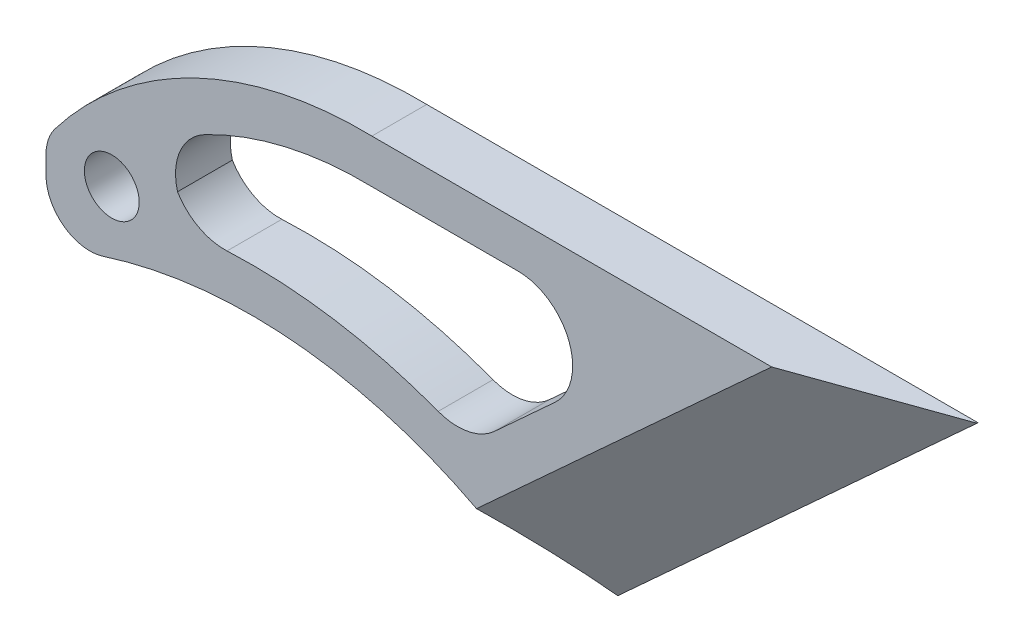
ISO-10303-21;
HEADER;
FILE_DESCRIPTION(('STEP AP214'),'2;1');
FILE_NAME('part.step','',(''),(''),'','','');
FILE_SCHEMA(('AUTOMOTIVE_DESIGN { 1 0 10303 214 1 1 1 1 }'));
ENDSEC;
DATA;
#1=APPLICATION_CONTEXT('core data for automotive mechanical design processes');
#2=APPLICATION_PROTOCOL_DEFINITION('international standard','automotive_design',2000,#1);
#3=PRODUCT_CONTEXT('',#1,'mechanical');
#4=PRODUCT('Part','Part','',(#3));
#5=PRODUCT_RELATED_PRODUCT_CATEGORY('part','',(#4));
#6=PRODUCT_DEFINITION_FORMATION('','',#4);
#7=PRODUCT_DEFINITION_CONTEXT('part definition',#1,'design');
#8=PRODUCT_DEFINITION('design','',#6,#7);
#9=PRODUCT_DEFINITION_SHAPE('','',#8);
#10=(LENGTH_UNIT() NAMED_UNIT(*) SI_UNIT(.MILLI.,.METRE.));
#11=(NAMED_UNIT(*) PLANE_ANGLE_UNIT() SI_UNIT($,.RADIAN.));
#12=(NAMED_UNIT(*) SI_UNIT($,.STERADIAN.) SOLID_ANGLE_UNIT());
#13=UNCERTAINTY_MEASURE_WITH_UNIT(LENGTH_MEASURE(1.E-05),#10,'distance_accuracy_value','');
#14=(GEOMETRIC_REPRESENTATION_CONTEXT(3) GLOBAL_UNCERTAINTY_ASSIGNED_CONTEXT((#13)) GLOBAL_UNIT_ASSIGNED_CONTEXT((#10,
#11,#12)) REPRESENTATION_CONTEXT('',''));
#15=CARTESIAN_POINT('',(0.,0.,0.));
#16=DIRECTION('',(0.,0.,1.));
#17=DIRECTION('',(1.,0.,0.));
#18=AXIS2_PLACEMENT_3D('',#15,#16,#17);
#19=CARTESIAN_POINT('',(11.9169511553707,-31.0374379710145,3.175));
#20=DIRECTION('',(0.,0.,-1.));
#21=DIRECTION('',(-1.,0.,0.));
#22=AXIS2_PLACEMENT_3D('',#19,#20,#21);
#23=CYLINDRICAL_SURFACE('',#22,28.1013810671292);
#24=DIRECTION('',(0.,0.,-1.));
#25=VECTOR('',#24,1.);
#26=CARTESIAN_POINT('',(29.9974,-9.525,3.175));
#27=LINE('',#26,#25);
#28=CARTESIAN_POINT('',(29.9974,-9.52499999999999,0.0531184775780828));
#29=VERTEX_POINT('',#28);
#30=CARTESIAN_POINT('',(29.9974,-9.525,0.));
#31=VERTEX_POINT('',#30);
#32=EDGE_CURVE('E234',#29,#31,#27,.T.);
#33=ORIENTED_EDGE('',*,*,#32,.F.);
#34=CARTESIAN_POINT('',(11.9169511553707,-31.0374379710145,-1.87262834166205));
#35=DIRECTION('',(-0.314846476618161,0.343812352467031,-0.884683424990101));
#36=DIRECTION('',(0.597477637531438,-0.65244558018433,-0.466192275298277));
#37=AXIS2_PLACEMENT_3D('',#34,#35,#36);
#38=ELLIPSE('',#37,31.7643354372143,28.1013810671292);
#39=CARTESIAN_POINT('',(24.9312058556093,-6.13127824139496,3.175));
#40=VERTEX_POINT('',#39);
#41=EDGE_CURVE('E172',#40,#29,#38,.T.);
#42=ORIENTED_EDGE('',*,*,#41,.F.);
#43=CARTESIAN_POINT('',(11.9169511553707,-31.0374379710145,3.175));
#44=DIRECTION('',(0.,0.,-1.));
#45=DIRECTION('',(-1.,0.,0.));
#46=AXIS2_PLACEMENT_3D('',#43,#44,#45);
#47=CIRCLE('',#46,28.1013810671292);
#48=CARTESIAN_POINT('',(3.31729707686681,-4.28424063667562,3.175));
#49=VERTEX_POINT('',#48);
#50=EDGE_CURVE('E212',#49,#40,#47,.T.);
#51=ORIENTED_EDGE('',*,*,#50,.F.);
#52=DIRECTION('',(0.,0.,-1.));
#53=VECTOR('',#52,1.);
#54=CARTESIAN_POINT('',(3.31729707686681,-4.28424063667562,3.175));
#55=LINE('',#54,#53);
#56=CARTESIAN_POINT('',(3.31729707686681,-4.28424063667562,0.));
#57=VERTEX_POINT('',#56);
#58=EDGE_CURVE('E251',#49,#57,#55,.T.);
#59=ORIENTED_EDGE('',*,*,#58,.T.);
#60=CARTESIAN_POINT('',(11.9169511553707,-31.0374379710145,0.));
#61=DIRECTION('',(0.,0.,-1.));
#62=DIRECTION('',(-1.,0.,0.));
#63=AXIS2_PLACEMENT_3D('',#60,#61,#62);
#64=CIRCLE('',#63,28.1013810671292);
#65=EDGE_CURVE('E223',#57,#31,#64,.T.);
#66=ORIENTED_EDGE('',*,*,#65,.T.);
#67=EDGE_LOOP('',(#33,#42,#51,#59,#66));
#68=FACE_BOUND('',#67,.T.);
#69=ADVANCED_FACE('F41',(#68),#23,.F.);
#70=CARTESIAN_POINT('',(18.3400784902697,-12.8792493820545,3.175));
#71=DIRECTION('',(0.,0.,1.));
#72=DIRECTION('',(1.,0.,0.));
#73=AXIS2_PLACEMENT_3D('',#70,#71,#72);
#74=PLANE('',#73);
#75=CARTESIAN_POINT('',(18.3400784902697,-12.8792493820545,3.175));
#76=DIRECTION('',(0.,0.,1.));
#77=DIRECTION('',(1.,0.,0.));
#78=AXIS2_PLACEMENT_3D('',#75,#76,#77);
#79=CIRCLE('',#78,19.8705676785396);
#80=CARTESIAN_POINT('',(18.8411337317088,6.985,3.175));
#81=VERTEX_POINT('',#80);
#82=CARTESIAN_POINT('',(9.21859200388982,4.77402068743162,3.175));
#83=VERTEX_POINT('',#82);
#84=EDGE_CURVE('E169',#81,#83,#79,.T.);
#85=ORIENTED_EDGE('',*,*,#84,.F.);
#86=DIRECTION('',(-1.,0.,0.));
#87=VECTOR('',#86,1.);
#88=CARTESIAN_POINT('',(35.4932109771133,6.985,3.175));
#89=LINE('',#88,#87);
#90=CARTESIAN_POINT('',(27.3248975794892,6.985,3.175));
#91=VERTEX_POINT('',#90);
#92=EDGE_CURVE('E155',#91,#81,#89,.T.);
#93=ORIENTED_EDGE('',*,*,#92,.F.);
#94=CARTESIAN_POINT('',(27.3248975794892,3.81,3.175));
#95=DIRECTION('',(0.,0.,1.));
#96=DIRECTION('',(1.,0.,0.));
#97=AXIS2_PLACEMENT_3D('',#94,#95,#96);
#98=CIRCLE('',#97,3.175);
#99=CARTESIAN_POINT('',(29.4691578262363,1.4684678105522,3.175));
#100=VERTEX_POINT('',#99);
#101=EDGE_CURVE('E267',#91,#100,#98,.F.);
#102=ORIENTED_EDGE('',*,*,#101,.T.);
#103=DIRECTION('',(0.737490453369385,0.675357558030573,0.));
#104=VECTOR('',#103,1.);
#105=CARTESIAN_POINT('',(24.4876480851746,-3.09335429664721,3.175));
#106=LINE('',#105,#104);
#107=CARTESIAN_POINT('',(25.9754267283609,-1.73091964171465,3.175));
#108=VERTEX_POINT('',#107);
#109=EDGE_CURVE('E164',#108,#100,#106,.T.);
#110=ORIENTED_EDGE('',*,*,#109,.F.);
#111=CARTESIAN_POINT('',(23.8311664816138,0.610612547733157,3.175));
#112=DIRECTION('',(0.,0.,1.));
#113=DIRECTION('',(1.,0.,0.));
#114=AXIS2_PLACEMENT_3D('',#111,#112,#113);
#115=CIRCLE('',#114,3.175);
#116=CARTESIAN_POINT('',(22.7125478575295,-2.36080418067297,3.175));
#117=VERTEX_POINT('',#116);
#118=EDGE_CURVE('E271',#108,#117,#115,.F.);
#119=ORIENTED_EDGE('',*,*,#118,.T.);
#120=CARTESIAN_POINT('',(11.9169511553707,-31.0374379710145,3.175));
#121=DIRECTION('',(0.,0.,-1.));
#122=DIRECTION('',(1.,0.,0.));
#123=AXIS2_PLACEMENT_3D('',#120,#121,#122);
#124=CIRCLE('',#123,30.6413810671292);
#125=CARTESIAN_POINT('',(10.4850992101731,-0.429529945341539,3.175));
#126=VERTEX_POINT('',#125);
#127=EDGE_CURVE('E176',#126,#117,#124,.T.);
#128=ORIENTED_EDGE('',*,*,#127,.F.);
#129=CARTESIAN_POINT('',(10.3367335109886,2.74200164354506,3.175));
#130=DIRECTION('',(0.,0.,1.));
#131=DIRECTION('',(1.,0.,0.));
#132=AXIS2_PLACEMENT_3D('',#129,#130,#131);
#133=CIRCLE('',#132,3.175);
#134=CARTESIAN_POINT('',(7.61665885682078,1.10437565579521,3.175));
#135=VERTEX_POINT('',#134);
#136=EDGE_CURVE('E63',#126,#135,#133,.F.);
#137=ORIENTED_EDGE('',*,*,#136,.T.);
#138=CARTESIAN_POINT('',(10.6760601579343,1.95330950406911,3.175));
#139=DIRECTION('',(0.,0.,1.));
#140=DIRECTION('',(1.,0.,0.));
#141=AXIS2_PLACEMENT_3D('',#138,#139,#140);
#142=CIRCLE('',#141,3.175);
#143=EDGE_CURVE('E50',#135,#83,#142,.F.);
#144=ORIENTED_EDGE('',*,*,#143,.T.);
#145=EDGE_LOOP('',(#85,#93,#102,#110,#119,#128,#137,#144));
#146=FACE_BOUND('',#145,.T.);
#147=ORIENTED_EDGE('',*,*,#50,.T.);
#148=DIRECTION('',(0.737490453369385,0.675357558030573,0.));
#149=VECTOR('',#148,1.);
#150=CARTESIAN_POINT('',(25.9963590229133,-5.15586325302131,3.175));
#151=LINE('',#150,#149);
#152=CARTESIAN_POINT('',(42.0278616952126,9.525,3.175));
#153=VERTEX_POINT('',#152);
#154=EDGE_CURVE('E187',#40,#153,#151,.T.);
#155=ORIENTED_EDGE('',*,*,#154,.T.);
#156=DIRECTION('',(-1.,0.,0.));
#157=VECTOR('',#156,1.);
#158=CARTESIAN_POINT('',(18.8722,9.525,3.175));
#159=LINE('',#158,#157);
#160=CARTESIAN_POINT('',(18.8722,9.525,3.175));
#161=VERTEX_POINT('',#160);
#162=EDGE_CURVE('E215',#153,#161,#159,.T.);
#163=ORIENTED_EDGE('',*,*,#162,.T.);
#164=CARTESIAN_POINT('',(18.3400784902697,-12.8792493820545,3.175));
#165=DIRECTION('',(0.,0.,1.));
#166=DIRECTION('',(1.,0.,0.));
#167=AXIS2_PLACEMENT_3D('',#164,#165,#166);
#168=CIRCLE('',#167,22.4105676785396);
#169=CARTESIAN_POINT('',(0.520319434525854,0.710810620375207,3.175));
#170=VERTEX_POINT('',#169);
#171=EDGE_CURVE('E205',#161,#170,#168,.T.);
#172=ORIENTED_EDGE('',*,*,#171,.T.);
#173=CARTESIAN_POINT('',(2.54,-0.829478447769485,3.175));
#174=DIRECTION('',(0.,0.,1.));
#175=DIRECTION('',(1.,0.,0.));
#176=AXIS2_PLACEMENT_3D('',#173,#174,#175);
#177=CIRCLE('',#176,2.54);
#178=CARTESIAN_POINT('',(0.,-0.829478447769485,3.175));
#179=VERTEX_POINT('',#178);
#180=EDGE_CURVE('E249',#170,#179,#177,.T.);
#181=ORIENTED_EDGE('',*,*,#180,.T.);
#182=DIRECTION('',(0.,-1.,0.));
#183=VECTOR('',#182,1.);
#184=CARTESIAN_POINT('',(0.,0.,3.175));
#185=LINE('',#184,#183);
#186=CARTESIAN_POINT('',(0.,-1.86609894225523,3.175));
#187=VERTEX_POINT('',#186);
#188=EDGE_CURVE('E208',#179,#187,#185,.T.);
#189=ORIENTED_EDGE('',*,*,#188,.T.);
#190=CARTESIAN_POINT('',(2.54,-1.86609894225523,3.175));
#191=DIRECTION('',(0.,0.,1.));
#192=DIRECTION('',(1.,0.,0.));
#193=AXIS2_PLACEMENT_3D('',#190,#191,#192);
#194=CIRCLE('',#193,2.54);
#195=EDGE_CURVE('E247',#187,#49,#194,.T.);
#196=ORIENTED_EDGE('',*,*,#195,.T.);
#197=EDGE_LOOP('',(#147,#155,#163,#172,#181,#189,#196));
#198=FACE_BOUND('',#197,.T.);
#199=CARTESIAN_POINT('',(3.81,-0.5334,3.175));
#200=DIRECTION('',(0.,0.,1.));
#201=DIRECTION('',(1.,0.,0.));
#202=AXIS2_PLACEMENT_3D('',#199,#200,#201);
#203=CIRCLE('',#202,1.5875);
#204=CARTESIAN_POINT('',(5.3975,-0.5334,3.175));
#205=VERTEX_POINT('',#204);
#206=EDGE_CURVE('E198',#205,#205,#203,.T.);
#207=ORIENTED_EDGE('',*,*,#206,.F.);
#208=EDGE_LOOP('',(#207));
#209=FACE_BOUND('',#208,.T.);
#210=ADVANCED_FACE('F174',(#146,#198,#209),#74,.T.);
#211=CARTESIAN_POINT('',(18.3400784902697,-12.8792493820545,3.175));
#212=DIRECTION('',(0.,0.,-1.));
#213=DIRECTION('',(-1.,0.,0.));
#214=AXIS2_PLACEMENT_3D('',#211,#212,#213);
#215=CYLINDRICAL_SURFACE('',#214,22.4105676785396);
#216=CARTESIAN_POINT('',(18.3400784902697,-12.8792493820545,0.));
#217=DIRECTION('',(0.,0.,1.));
#218=DIRECTION('',(1.,0.,0.));
#219=AXIS2_PLACEMENT_3D('',#216,#217,#218);
#220=CIRCLE('',#219,22.4105676785396);
#221=CARTESIAN_POINT('',(18.8722,9.525,0.));
#222=VERTEX_POINT('',#221);
#223=CARTESIAN_POINT('',(0.520319434525854,0.710810620375207,0.));
#224=VERTEX_POINT('',#223);
#225=EDGE_CURVE('E204',#222,#224,#220,.T.);
#226=ORIENTED_EDGE('',*,*,#225,.T.);
#227=DIRECTION('',(0.,0.,-1.));
#228=VECTOR('',#227,1.);
#229=CARTESIAN_POINT('',(0.520319434525851,0.71081062037521,3.175));
#230=LINE('',#229,#228);
#231=EDGE_CURVE('E245',#224,#170,#230,.F.);
#232=ORIENTED_EDGE('',*,*,#231,.T.);
#233=ORIENTED_EDGE('',*,*,#171,.F.);
#234=DIRECTION('',(0.,0.,-1.));
#235=VECTOR('',#234,1.);
#236=CARTESIAN_POINT('',(18.8722,9.525,3.175));
#237=LINE('',#236,#235);
#238=EDGE_CURVE('E217',#161,#222,#237,.T.);
#239=ORIENTED_EDGE('',*,*,#238,.T.);
#240=EDGE_LOOP('',(#226,#232,#233,#239));
#241=FACE_BOUND('',#240,.T.);
#242=ADVANCED_FACE('F323',(#241),#215,.T.);
#243=CARTESIAN_POINT('',(0.,0.,3.175));
#244=DIRECTION('',(1.,0.,0.));
#245=DIRECTION('',(0.,1.,0.));
#246=AXIS2_PLACEMENT_3D('',#243,#244,#245);
#247=PLANE('',#246);
#248=ORIENTED_EDGE('',*,*,#188,.F.);
#249=DIRECTION('',(0.,0.,-1.));
#250=VECTOR('',#249,1.);
#251=CARTESIAN_POINT('',(0.,-0.829478447769485,3.175));
#252=LINE('',#251,#250);
#253=CARTESIAN_POINT('',(0.,-0.829478447769485,0.));
#254=VERTEX_POINT('',#253);
#255=EDGE_CURVE('E238',#179,#254,#252,.T.);
#256=ORIENTED_EDGE('',*,*,#255,.T.);
#257=DIRECTION('',(0.,-1.,0.));
#258=VECTOR('',#257,1.);
#259=CARTESIAN_POINT('',(0.,0.,0.));
#260=LINE('',#259,#258);
#261=CARTESIAN_POINT('',(0.,-1.86609894225523,0.));
#262=VERTEX_POINT('',#261);
#263=EDGE_CURVE('E220',#254,#262,#260,.T.);
#264=ORIENTED_EDGE('',*,*,#263,.T.);
#265=DIRECTION('',(0.,0.,-1.));
#266=VECTOR('',#265,1.);
#267=CARTESIAN_POINT('',(0.,-1.86609894225523,3.175));
#268=LINE('',#267,#266);
#269=EDGE_CURVE('E236',#262,#187,#268,.F.);
#270=ORIENTED_EDGE('',*,*,#269,.T.);
#271=EDGE_LOOP('',(#248,#256,#264,#270));
#272=FACE_BOUND('',#271,.T.);
#273=ADVANCED_FACE('F330',(#272),#247,.F.);
#274=CARTESIAN_POINT('',(50.8,9.525,3.175));
#275=DIRECTION('',(-0.675357558030573,0.737490453369385,0.));
#276=DIRECTION('',(-0.737490453369385,-0.675357558030573,0.));
#277=AXIS2_PLACEMENT_3D('',#274,#275,#276);
#278=PLANE('',#277);
#279=DIRECTION('',(0.,0.,-1.));
#280=VECTOR('',#279,1.);
#281=CARTESIAN_POINT('',(50.8,9.525,3.175));
#282=LINE('',#281,#280);
#283=CARTESIAN_POINT('',(50.8,9.525,0.0531184775780654));
#284=VERTEX_POINT('',#283);
#285=CARTESIAN_POINT('',(50.8,9.525,0.));
#286=VERTEX_POINT('',#285);
#287=EDGE_CURVE('E232',#284,#286,#282,.T.);
#288=ORIENTED_EDGE('',*,*,#287,.F.);
#289=DIRECTION('',(-0.737490453369385,-0.675357558030573,0.));
#290=VECTOR('',#289,1.);
#291=CARTESIAN_POINT('',(50.8,9.525,0.0531184775780847));
#292=LINE('',#291,#290);
#293=EDGE_CURVE('E195',#284,#29,#292,.T.);
#294=ORIENTED_EDGE('',*,*,#293,.T.);
#295=ORIENTED_EDGE('',*,*,#32,.T.);
#296=DIRECTION('',(0.737490453369385,0.675357558030573,0.));
#297=VECTOR('',#296,1.);
#298=CARTESIAN_POINT('',(50.8,9.525,0.));
#299=LINE('',#298,#297);
#300=EDGE_CURVE('E226',#31,#286,#299,.T.);
#301=ORIENTED_EDGE('',*,*,#300,.T.);
#302=EDGE_LOOP('',(#288,#294,#295,#301));
#303=FACE_BOUND('',#302,.T.);
#304=ADVANCED_FACE('F328',(#303),#278,.F.);
#305=CARTESIAN_POINT('',(18.8722,9.525,3.175));
#306=DIRECTION('',(0.,-1.,0.));
#307=DIRECTION('',(0.,0.,-1.));
#308=AXIS2_PLACEMENT_3D('',#305,#306,#307);
#309=PLANE('',#308);
#310=ORIENTED_EDGE('',*,*,#162,.F.);
#311=DIRECTION('',(0.942116371667455,0.,-0.335286060306943));
#312=VECTOR('',#311,1.);
#313=CARTESIAN_POINT('',(21.4752840520982,9.525,10.4893753726686));
#314=LINE('',#313,#312);
#315=EDGE_CURVE('E190',#153,#284,#314,.T.);
#316=ORIENTED_EDGE('',*,*,#315,.T.);
#317=ORIENTED_EDGE('',*,*,#287,.T.);
#318=DIRECTION('',(-1.,0.,0.));
#319=VECTOR('',#318,1.);
#320=CARTESIAN_POINT('',(18.8722,9.525,0.));
#321=LINE('',#320,#319);
#322=EDGE_CURVE('E209',#286,#222,#321,.T.);
#323=ORIENTED_EDGE('',*,*,#322,.T.);
#324=ORIENTED_EDGE('',*,*,#238,.F.);
#325=EDGE_LOOP('',(#310,#316,#317,#323,#324));
#326=FACE_BOUND('',#325,.T.);
#327=ADVANCED_FACE('F365',(#326),#309,.F.);
#328=CARTESIAN_POINT('',(18.3400784902697,-12.8792493820545,0.));
#329=DIRECTION('',(0.,0.,1.));
#330=DIRECTION('',(1.,0.,0.));
#331=AXIS2_PLACEMENT_3D('',#328,#329,#330);
#332=PLANE('',#331);
#333=DIRECTION('',(1.,0.,0.));
#334=VECTOR('',#333,1.);
#335=CARTESIAN_POINT('',(35.4932109771133,6.985,0.));
#336=LINE('',#335,#334);
#337=CARTESIAN_POINT('',(18.8411337317088,6.985,0.));
#338=VERTEX_POINT('',#337);
#339=CARTESIAN_POINT('',(27.3248975794892,6.985,0.));
#340=VERTEX_POINT('',#339);
#341=EDGE_CURVE('E180',#338,#340,#336,.T.);
#342=ORIENTED_EDGE('',*,*,#341,.F.);
#343=CARTESIAN_POINT('',(18.3400784902697,-12.8792493820545,0.));
#344=DIRECTION('',(0.,0.,1.));
#345=DIRECTION('',(1.,0.,0.));
#346=AXIS2_PLACEMENT_3D('',#343,#344,#345);
#347=CIRCLE('',#346,19.8705676785396);
#348=CARTESIAN_POINT('',(9.21859200388982,4.77402068743162,0.));
#349=VERTEX_POINT('',#348);
#350=EDGE_CURVE('E171',#349,#338,#347,.F.);
#351=ORIENTED_EDGE('',*,*,#350,.F.);
#352=CARTESIAN_POINT('',(10.6760601579343,1.95330950406911,0.));
#353=DIRECTION('',(0.,0.,1.));
#354=DIRECTION('',(1.,0.,0.));
#355=AXIS2_PLACEMENT_3D('',#352,#353,#354);
#356=CIRCLE('',#355,3.175);
#357=CARTESIAN_POINT('',(7.61665885682078,1.10437565579521,0.));
#358=VERTEX_POINT('',#357);
#359=EDGE_CURVE('E13',#349,#358,#356,.T.);
#360=ORIENTED_EDGE('',*,*,#359,.T.);
#361=CARTESIAN_POINT('',(10.3367335109886,2.74200164354506,0.));
#362=DIRECTION('',(0.,0.,1.));
#363=DIRECTION('',(1.,0.,0.));
#364=AXIS2_PLACEMENT_3D('',#361,#362,#363);
#365=CIRCLE('',#364,3.175);
#366=CARTESIAN_POINT('',(10.4850992101731,-0.429529945341539,0.));
#367=VERTEX_POINT('',#366);
#368=EDGE_CURVE('E276',#358,#367,#365,.T.);
#369=ORIENTED_EDGE('',*,*,#368,.T.);
#370=CARTESIAN_POINT('',(11.9169511553707,-31.0374379710145,0.));
#371=DIRECTION('',(0.,0.,1.));
#372=DIRECTION('',(1.,0.,0.));
#373=AXIS2_PLACEMENT_3D('',#370,#371,#372);
#374=CIRCLE('',#373,30.6413810671292);
#375=CARTESIAN_POINT('',(22.7125478575295,-2.36080418067297,0.));
#376=VERTEX_POINT('',#375);
#377=EDGE_CURVE('E283',#376,#367,#374,.T.);
#378=ORIENTED_EDGE('',*,*,#377,.F.);
#379=CARTESIAN_POINT('',(23.8311664816138,0.610612547733157,0.));
#380=DIRECTION('',(0.,0.,1.));
#381=DIRECTION('',(1.,0.,0.));
#382=AXIS2_PLACEMENT_3D('',#379,#380,#381);
#383=CIRCLE('',#382,3.175);
#384=CARTESIAN_POINT('',(25.9754267283609,-1.73091964171465,0.));
#385=VERTEX_POINT('',#384);
#386=EDGE_CURVE('E273',#376,#385,#383,.T.);
#387=ORIENTED_EDGE('',*,*,#386,.T.);
#388=DIRECTION('',(-0.737490453369385,-0.675357558030573,0.));
#389=VECTOR('',#388,1.);
#390=CARTESIAN_POINT('',(24.4876480851746,-3.09335429664721,0.));
#391=LINE('',#390,#389);
#392=CARTESIAN_POINT('',(29.4691578262363,1.4684678105522,0.));
#393=VERTEX_POINT('',#392);
#394=EDGE_CURVE('E291',#393,#385,#391,.T.);
#395=ORIENTED_EDGE('',*,*,#394,.F.);
#396=CARTESIAN_POINT('',(27.3248975794892,3.81,0.));
#397=DIRECTION('',(0.,0.,1.));
#398=DIRECTION('',(1.,0.,0.));
#399=AXIS2_PLACEMENT_3D('',#396,#397,#398);
#400=CIRCLE('',#399,3.175);
#401=EDGE_CURVE('E269',#393,#340,#400,.T.);
#402=ORIENTED_EDGE('',*,*,#401,.T.);
#403=EDGE_LOOP('',(#342,#351,#360,#369,#378,#387,#395,#402));
#404=FACE_BOUND('',#403,.T.);
#405=CARTESIAN_POINT('',(3.81,-0.5334,0.));
#406=DIRECTION('',(0.,0.,1.));
#407=DIRECTION('',(1.,0.,0.));
#408=AXIS2_PLACEMENT_3D('',#405,#406,#407);
#409=CIRCLE('',#408,1.5875);
#410=CARTESIAN_POINT('',(5.3975,-0.5334,0.));
#411=VERTEX_POINT('',#410);
#412=EDGE_CURVE('E201',#411,#411,#409,.F.);
#413=ORIENTED_EDGE('',*,*,#412,.F.);
#414=EDGE_LOOP('',(#413));
#415=FACE_BOUND('',#414,.T.);
#416=ORIENTED_EDGE('',*,*,#263,.F.);
#417=CARTESIAN_POINT('',(2.54,-0.829478447769485,0.));
#418=DIRECTION('',(0.,0.,1.));
#419=DIRECTION('',(1.,0.,0.));
#420=AXIS2_PLACEMENT_3D('',#417,#418,#419);
#421=CIRCLE('',#420,2.54);
#422=EDGE_CURVE('E243',#254,#224,#421,.F.);
#423=ORIENTED_EDGE('',*,*,#422,.T.);
#424=ORIENTED_EDGE('',*,*,#225,.F.);
#425=ORIENTED_EDGE('',*,*,#322,.F.);
#426=ORIENTED_EDGE('',*,*,#300,.F.);
#427=ORIENTED_EDGE('',*,*,#65,.F.);
#428=CARTESIAN_POINT('',(2.54,-1.86609894225523,0.));
#429=DIRECTION('',(0.,0.,1.));
#430=DIRECTION('',(1.,0.,0.));
#431=AXIS2_PLACEMENT_3D('',#428,#429,#430);
#432=CIRCLE('',#431,2.54);
#433=EDGE_CURVE('E241',#57,#262,#432,.F.);
#434=ORIENTED_EDGE('',*,*,#433,.T.);
#435=EDGE_LOOP('',(#416,#423,#424,#425,#426,#427,#434));
#436=FACE_BOUND('',#435,.T.);
#437=ADVANCED_FACE('F281',(#404,#415,#436),#332,.F.);
#438=CARTESIAN_POINT('',(2.54,-0.829478447769485,3.175));
#439=DIRECTION('',(0.,0.,-1.));
#440=DIRECTION('',(-1.,0.,0.));
#441=AXIS2_PLACEMENT_3D('',#438,#439,#440);
#442=CYLINDRICAL_SURFACE('',#441,2.54);
#443=ORIENTED_EDGE('',*,*,#180,.F.);
#444=ORIENTED_EDGE('',*,*,#231,.F.);
#445=ORIENTED_EDGE('',*,*,#422,.F.);
#446=ORIENTED_EDGE('',*,*,#255,.F.);
#447=EDGE_LOOP('',(#443,#444,#445,#446));
#448=FACE_BOUND('',#447,.T.);
#449=ADVANCED_FACE('F337',(#448),#442,.T.);
#450=CARTESIAN_POINT('',(2.54,-1.86609894225523,3.175));
#451=DIRECTION('',(0.,0.,-1.));
#452=DIRECTION('',(-1.,0.,0.));
#453=AXIS2_PLACEMENT_3D('',#450,#451,#452);
#454=CYLINDRICAL_SURFACE('',#453,2.54);
#455=ORIENTED_EDGE('',*,*,#195,.F.);
#456=ORIENTED_EDGE('',*,*,#269,.F.);
#457=ORIENTED_EDGE('',*,*,#433,.F.);
#458=ORIENTED_EDGE('',*,*,#58,.F.);
#459=EDGE_LOOP('',(#455,#456,#457,#458));
#460=FACE_BOUND('',#459,.T.);
#461=ADVANCED_FACE('F339',(#460),#454,.T.);
#462=CARTESIAN_POINT('',(3.81,-0.5334,-0.00100000000000013));
#463=DIRECTION('',(0.,0.,1.));
#464=DIRECTION('',(1.,0.,0.));
#465=AXIS2_PLACEMENT_3D('',#462,#463,#464);
#466=CYLINDRICAL_SURFACE('',#465,1.5875);
#467=ORIENTED_EDGE('',*,*,#206,.T.);
#468=EDGE_LOOP('',(#467));
#469=FACE_BOUND('',#468,.T.);
#470=ORIENTED_EDGE('',*,*,#412,.T.);
#471=EDGE_LOOP('',(#470));
#472=FACE_BOUND('',#471,.T.);
#473=ADVANCED_FACE('F342',(#469,#472),#466,.F.);
#474=CARTESIAN_POINT('',(25.9963590229133,-5.15586325302131,3.175));
#475=DIRECTION('',(-0.314846476618161,0.343812352467031,-0.884683424990101));
#476=DIRECTION('',(0.,0.932086932633551,0.362234661530034));
#477=AXIS2_PLACEMENT_3D('',#474,#475,#476);
#478=PLANE('',#477);
#479=ORIENTED_EDGE('',*,*,#315,.F.);
#480=ORIENTED_EDGE('',*,*,#154,.F.);
#481=ORIENTED_EDGE('',*,*,#41,.T.);
#482=ORIENTED_EDGE('',*,*,#293,.F.);
#483=EDGE_LOOP('',(#479,#480,#481,#482));
#484=FACE_BOUND('',#483,.T.);
#485=ADVANCED_FACE('F347',(#484),#478,.F.);
#486=CARTESIAN_POINT('',(18.3400784902697,-12.8792493820545,-0.00100000000000013));
#487=DIRECTION('',(0.,0.,1.));
#488=DIRECTION('',(1.,0.,0.));
#489=AXIS2_PLACEMENT_3D('',#486,#487,#488);
#490=CYLINDRICAL_SURFACE('',#489,19.8705676785396);
#491=ORIENTED_EDGE('',*,*,#84,.T.);
#492=DIRECTION('',(0.,0.,1.));
#493=VECTOR('',#492,1.);
#494=CARTESIAN_POINT('',(9.21859200388982,4.77402068743162,-0.00100000000000013));
#495=LINE('',#494,#493);
#496=EDGE_CURVE('E265',#83,#349,#495,.F.);
#497=ORIENTED_EDGE('',*,*,#496,.T.);
#498=ORIENTED_EDGE('',*,*,#350,.T.);
#499=DIRECTION('',(0.,0.,1.));
#500=VECTOR('',#499,1.);
#501=CARTESIAN_POINT('',(18.8411337317088,6.985,-0.00100000000000013));
#502=LINE('',#501,#500);
#503=EDGE_CURVE('E159',#338,#81,#502,.T.);
#504=ORIENTED_EDGE('',*,*,#503,.T.);
#505=EDGE_LOOP('',(#491,#497,#498,#504));
#506=FACE_BOUND('',#505,.T.);
#507=ADVANCED_FACE('F168',(#506),#490,.F.);
#508=CARTESIAN_POINT('',(35.4932109771133,6.985,-0.00100000000000013));
#509=DIRECTION('',(0.,1.,0.));
#510=DIRECTION('',(-1.,0.,0.));
#511=AXIS2_PLACEMENT_3D('',#508,#509,#510);
#512=PLANE('',#511);
#513=ORIENTED_EDGE('',*,*,#341,.T.);
#514=DIRECTION('',(0.,0.,1.));
#515=VECTOR('',#514,1.);
#516=CARTESIAN_POINT('',(27.3248975794892,6.985,3.175));
#517=LINE('',#516,#515);
#518=EDGE_CURVE('E162',#340,#91,#517,.T.);
#519=ORIENTED_EDGE('',*,*,#518,.T.);
#520=ORIENTED_EDGE('',*,*,#92,.T.);
#521=ORIENTED_EDGE('',*,*,#503,.F.);
#522=EDGE_LOOP('',(#513,#519,#520,#521));
#523=FACE_BOUND('',#522,.T.);
#524=ADVANCED_FACE('F158',(#523),#512,.F.);
#525=CARTESIAN_POINT('',(24.4876480851746,-3.09335429664721,-0.00100000000000013));
#526=DIRECTION('',(0.675357558030573,-0.737490453369385,0.));
#527=DIRECTION('',(0.737490453369385,0.675357558030573,0.));
#528=AXIS2_PLACEMENT_3D('',#525,#526,#527);
#529=PLANE('',#528);
#530=ORIENTED_EDGE('',*,*,#109,.T.);
#531=DIRECTION('',(0.,0.,1.));
#532=VECTOR('',#531,1.);
#533=CARTESIAN_POINT('',(29.4691578262363,1.4684678105522,0.));
#534=LINE('',#533,#532);
#535=EDGE_CURVE('E258',#100,#393,#534,.F.);
#536=ORIENTED_EDGE('',*,*,#535,.T.);
#537=ORIENTED_EDGE('',*,*,#394,.T.);
#538=DIRECTION('',(0.,0.,-1.));
#539=VECTOR('',#538,1.);
#540=CARTESIAN_POINT('',(25.9754267283609,-1.73091964171465,3.175));
#541=LINE('',#540,#539);
#542=EDGE_CURVE('E255',#385,#108,#541,.F.);
#543=ORIENTED_EDGE('',*,*,#542,.T.);
#544=EDGE_LOOP('',(#530,#536,#537,#543));
#545=FACE_BOUND('',#544,.T.);
#546=ADVANCED_FACE('F301',(#545),#529,.F.);
#547=CARTESIAN_POINT('',(11.9169511553707,-31.0374379710145,-0.00100000000000013));
#548=DIRECTION('',(0.,0.,1.));
#549=DIRECTION('',(1.,0.,0.));
#550=AXIS2_PLACEMENT_3D('',#547,#548,#549);
#551=CYLINDRICAL_SURFACE('',#550,30.6413810671292);
#552=ORIENTED_EDGE('',*,*,#127,.T.);
#553=DIRECTION('',(0.,0.,1.));
#554=VECTOR('',#553,1.);
#555=CARTESIAN_POINT('',(22.7125478575295,-2.36080418067297,-0.00100000000000013));
#556=LINE('',#555,#554);
#557=EDGE_CURVE('E263',#117,#376,#556,.F.);
#558=ORIENTED_EDGE('',*,*,#557,.T.);
#559=ORIENTED_EDGE('',*,*,#377,.T.);
#560=DIRECTION('',(0.,0.,1.));
#561=VECTOR('',#560,1.);
#562=CARTESIAN_POINT('',(10.4850992101731,-0.429529945341539,-0.00100000000000013));
#563=LINE('',#562,#561);
#564=EDGE_CURVE('E260',#367,#126,#563,.T.);
#565=ORIENTED_EDGE('',*,*,#564,.T.);
#566=EDGE_LOOP('',(#552,#558,#559,#565));
#567=FACE_BOUND('',#566,.T.);
#568=ADVANCED_FACE('F289',(#567),#551,.T.);
#569=CARTESIAN_POINT('',(27.3248975794892,3.81,-0.00100000000000013));
#570=DIRECTION('',(0.,0.,-1.));
#571=DIRECTION('',(-1.,0.,0.));
#572=AXIS2_PLACEMENT_3D('',#569,#570,#571);
#573=CYLINDRICAL_SURFACE('',#572,3.175);
#574=ORIENTED_EDGE('',*,*,#401,.F.);
#575=ORIENTED_EDGE('',*,*,#535,.F.);
#576=ORIENTED_EDGE('',*,*,#101,.F.);
#577=ORIENTED_EDGE('',*,*,#518,.F.);
#578=EDGE_LOOP('',(#574,#575,#576,#577));
#579=FACE_BOUND('',#578,.T.);
#580=ADVANCED_FACE('F307',(#579),#573,.F.);
#581=CARTESIAN_POINT('',(23.8311664816138,0.610612547733157,-0.00100000000000013));
#582=DIRECTION('',(0.,0.,1.));
#583=DIRECTION('',(1.,0.,0.));
#584=AXIS2_PLACEMENT_3D('',#581,#582,#583);
#585=CYLINDRICAL_SURFACE('',#584,3.175);
#586=ORIENTED_EDGE('',*,*,#386,.F.);
#587=ORIENTED_EDGE('',*,*,#557,.F.);
#588=ORIENTED_EDGE('',*,*,#118,.F.);
#589=ORIENTED_EDGE('',*,*,#542,.F.);
#590=EDGE_LOOP('',(#586,#587,#588,#589));
#591=FACE_BOUND('',#590,.T.);
#592=ADVANCED_FACE('F305',(#591),#585,.F.);
#593=CARTESIAN_POINT('',(10.6760601579343,1.95330950406911,-0.00100000000000013));
#594=DIRECTION('',(0.,0.,1.));
#595=DIRECTION('',(1.,0.,0.));
#596=AXIS2_PLACEMENT_3D('',#593,#594,#595);
#597=CYLINDRICAL_SURFACE('',#596,3.175);
#598=DIRECTION('',(0.,0.,1.));
#599=VECTOR('',#598,1.);
#600=CARTESIAN_POINT('',(7.61665885682078,1.10437565579521,1.5875));
#601=LINE('',#600,#599);
#602=EDGE_CURVE('E45',#358,#135,#601,.T.);
#603=ORIENTED_EDGE('',*,*,#602,.F.);
#604=ORIENTED_EDGE('',*,*,#359,.F.);
#605=ORIENTED_EDGE('',*,*,#496,.F.);
#606=ORIENTED_EDGE('',*,*,#143,.F.);
#607=EDGE_LOOP('',(#603,#604,#605,#606));
#608=FACE_BOUND('',#607,.T.);
#609=ADVANCED_FACE('F43',(#608),#597,.F.);
#610=CARTESIAN_POINT('',(10.3367335109886,2.74200164354506,-0.00100000000000013));
#611=DIRECTION('',(0.,0.,-1.));
#612=DIRECTION('',(-1.,0.,0.));
#613=AXIS2_PLACEMENT_3D('',#610,#611,#612);
#614=CYLINDRICAL_SURFACE('',#613,3.175);
#615=ORIENTED_EDGE('',*,*,#368,.F.);
#616=ORIENTED_EDGE('',*,*,#602,.T.);
#617=ORIENTED_EDGE('',*,*,#136,.F.);
#618=ORIENTED_EDGE('',*,*,#564,.F.);
#619=EDGE_LOOP('',(#615,#616,#617,#618));
#620=FACE_BOUND('',#619,.T.);
#621=ADVANCED_FACE('F293',(#620),#614,.F.);
#622=CLOSED_SHELL('',(#69,#210,#242,#273,#304,#327,#437,#449,#461,#473,#485,#507,#524,#546,#568,
#580,#592,#609,#621));
#623=MANIFOLD_SOLID_BREP('B2',#622);
#624=ADVANCED_BREP_SHAPE_REPRESENTATION('',(#18,#623),#14);
#625=SHAPE_DEFINITION_REPRESENTATION(#9,#624);
ENDSEC;
END-ISO-10303-21;
